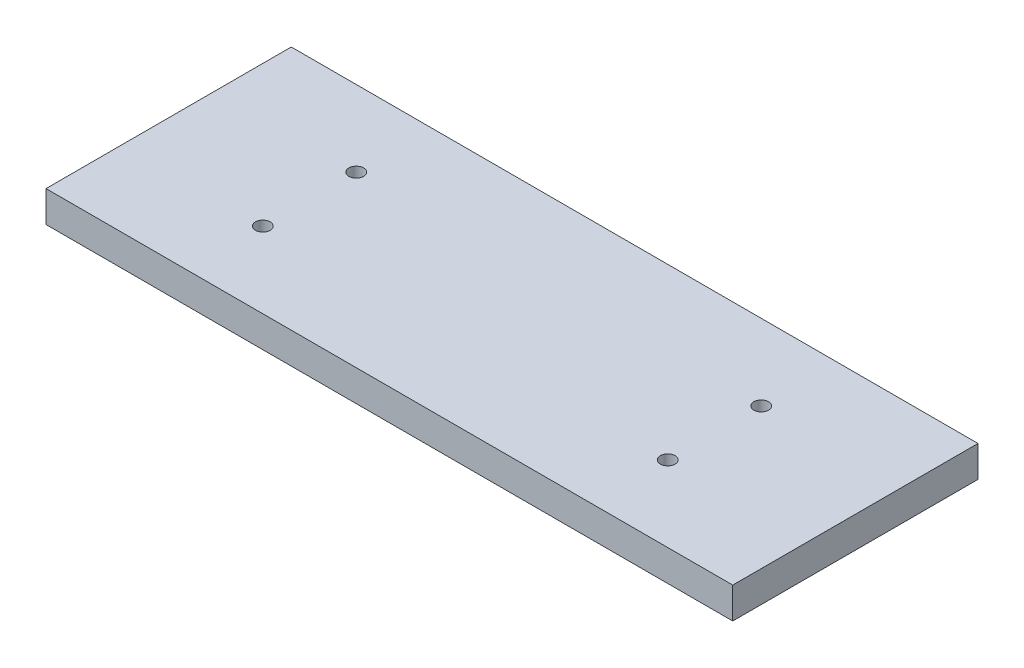
ISO-10303-21;
HEADER;
FILE_DESCRIPTION(('STEP AP214'),'2;1');
FILE_NAME('part.step','',(''),(''),'','','');
FILE_SCHEMA(('AUTOMOTIVE_DESIGN { 1 0 10303 214 1 1 1 1 }'));
ENDSEC;
DATA;
#1=APPLICATION_CONTEXT('core data for automotive mechanical design processes');
#2=APPLICATION_PROTOCOL_DEFINITION('international standard','automotive_design',2000,#1);
#3=PRODUCT_CONTEXT('',#1,'mechanical');
#4=PRODUCT('Part','Part','',(#3));
#5=PRODUCT_RELATED_PRODUCT_CATEGORY('part','',(#4));
#6=PRODUCT_DEFINITION_FORMATION('','',#4);
#7=PRODUCT_DEFINITION_CONTEXT('part definition',#1,'design');
#8=PRODUCT_DEFINITION('design','',#6,#7);
#9=PRODUCT_DEFINITION_SHAPE('','',#8);
#10=(LENGTH_UNIT() NAMED_UNIT(*) SI_UNIT(.MILLI.,.METRE.));
#11=(NAMED_UNIT(*) PLANE_ANGLE_UNIT() SI_UNIT($,.RADIAN.));
#12=(NAMED_UNIT(*) SI_UNIT($,.STERADIAN.) SOLID_ANGLE_UNIT());
#13=UNCERTAINTY_MEASURE_WITH_UNIT(LENGTH_MEASURE(1.E-05),#10,'distance_accuracy_value','');
#14=(GEOMETRIC_REPRESENTATION_CONTEXT(3) GLOBAL_UNCERTAINTY_ASSIGNED_CONTEXT((#13)) GLOBAL_UNIT_ASSIGNED_CONTEXT((#10,
#11,#12)) REPRESENTATION_CONTEXT('',''));
#15=CARTESIAN_POINT('',(0.,0.,0.));
#16=DIRECTION('',(0.,0.,1.));
#17=DIRECTION('',(1.,0.,0.));
#18=AXIS2_PLACEMENT_3D('',#15,#16,#17);
#19=CARTESIAN_POINT('',(-63.8053097345133,6.35,-18.1194690265487));
#20=DIRECTION('',(1.,0.,0.));
#21=DIRECTION('',(0.,0.,-1.));
#22=AXIS2_PLACEMENT_3D('',#19,#20,#21);
#23=PLANE('',#22);
#24=DIRECTION('',(0.,0.,1.));
#25=VECTOR('',#24,1.);
#26=CARTESIAN_POINT('',(-63.8053097345133,0.,-18.1194690265487));
#27=LINE('',#26,#25);
#28=CARTESIAN_POINT('',(-63.8053097345133,0.,-18.1194690265487));
#29=VERTEX_POINT('',#28);
#30=CARTESIAN_POINT('',(-63.8053097345133,0.,31.8805309734513));
#31=VERTEX_POINT('',#30);
#32=EDGE_CURVE('E96',#29,#31,#27,.T.);
#33=ORIENTED_EDGE('',*,*,#32,.T.);
#34=DIRECTION('',(0.,-1.,0.));
#35=VECTOR('',#34,1.);
#36=CARTESIAN_POINT('',(-63.8053097345133,6.35,31.8805309734513));
#37=LINE('',#36,#35);
#38=CARTESIAN_POINT('',(-63.8053097345133,6.35,31.8805309734513));
#39=VERTEX_POINT('',#38);
#40=EDGE_CURVE('E11',#39,#31,#37,.T.);
#41=ORIENTED_EDGE('',*,*,#40,.F.);
#42=DIRECTION('',(0.,0.,1.));
#43=VECTOR('',#42,1.);
#44=CARTESIAN_POINT('',(-63.8053097345133,6.35,-18.1194690265487));
#45=LINE('',#44,#43);
#46=CARTESIAN_POINT('',(-63.8053097345133,6.35,-18.1194690265487));
#47=VERTEX_POINT('',#46);
#48=EDGE_CURVE('E84',#47,#39,#45,.T.);
#49=ORIENTED_EDGE('',*,*,#48,.F.);
#50=DIRECTION('',(0.,-1.,0.));
#51=VECTOR('',#50,1.);
#52=CARTESIAN_POINT('',(-63.8053097345133,6.35,-18.1194690265487));
#53=LINE('',#52,#51);
#54=EDGE_CURVE('E92',#47,#29,#53,.T.);
#55=ORIENTED_EDGE('',*,*,#54,.T.);
#56=EDGE_LOOP('',(#33,#41,#49,#55));
#57=FACE_BOUND('',#56,.T.);
#58=ADVANCED_FACE('F33',(#57),#23,.F.);
#59=CARTESIAN_POINT('',(-63.8053097345133,6.35,31.8805309734513));
#60=DIRECTION('',(0.,0.,-1.));
#61=DIRECTION('',(-1.,0.,0.));
#62=AXIS2_PLACEMENT_3D('',#59,#60,#61);
#63=PLANE('',#62);
#64=DIRECTION('',(1.,0.,0.));
#65=VECTOR('',#64,1.);
#66=CARTESIAN_POINT('',(-63.8053097345133,0.,31.8805309734513));
#67=LINE('',#66,#65);
#68=CARTESIAN_POINT('',(76.1946902654867,0.,31.8805309734513));
#69=VERTEX_POINT('',#68);
#70=EDGE_CURVE('E88',#31,#69,#67,.T.);
#71=ORIENTED_EDGE('',*,*,#70,.T.);
#72=DIRECTION('',(0.,-1.,0.));
#73=VECTOR('',#72,1.);
#74=CARTESIAN_POINT('',(76.1946902654867,6.35,31.8805309734513));
#75=LINE('',#74,#73);
#76=CARTESIAN_POINT('',(76.1946902654867,6.35,31.8805309734513));
#77=VERTEX_POINT('',#76);
#78=EDGE_CURVE('E41',#77,#69,#75,.T.);
#79=ORIENTED_EDGE('',*,*,#78,.F.);
#80=DIRECTION('',(1.,0.,0.));
#81=VECTOR('',#80,1.);
#82=CARTESIAN_POINT('',(-63.8053097345133,6.35,31.8805309734513));
#83=LINE('',#82,#81);
#84=EDGE_CURVE('E79',#39,#77,#83,.T.);
#85=ORIENTED_EDGE('',*,*,#84,.F.);
#86=ORIENTED_EDGE('',*,*,#40,.T.);
#87=EDGE_LOOP('',(#71,#79,#85,#86));
#88=FACE_BOUND('',#87,.T.);
#89=ADVANCED_FACE('F87',(#88),#63,.F.);
#90=CARTESIAN_POINT('',(76.1946902654867,6.35,-18.1194690265487));
#91=DIRECTION('',(-1.,0.,0.));
#92=DIRECTION('',(0.,0.,1.));
#93=AXIS2_PLACEMENT_3D('',#90,#91,#92);
#94=PLANE('',#93);
#95=DIRECTION('',(0.,0.,-1.));
#96=VECTOR('',#95,1.);
#97=CARTESIAN_POINT('',(76.1946902654867,0.,-18.1194690265487));
#98=LINE('',#97,#96);
#99=CARTESIAN_POINT('',(76.1946902654867,0.,-18.1194690265487));
#100=VERTEX_POINT('',#99);
#101=EDGE_CURVE('E66',#69,#100,#98,.T.);
#102=ORIENTED_EDGE('',*,*,#101,.T.);
#103=DIRECTION('',(0.,-1.,0.));
#104=VECTOR('',#103,1.);
#105=CARTESIAN_POINT('',(76.1946902654867,6.35,-18.1194690265487));
#106=LINE('',#105,#104);
#107=CARTESIAN_POINT('',(76.1946902654867,6.35,-18.1194690265487));
#108=VERTEX_POINT('',#107);
#109=EDGE_CURVE('E89',#108,#100,#106,.T.);
#110=ORIENTED_EDGE('',*,*,#109,.F.);
#111=DIRECTION('',(0.,0.,-1.));
#112=VECTOR('',#111,1.);
#113=CARTESIAN_POINT('',(76.1946902654867,6.35,-18.1194690265487));
#114=LINE('',#113,#112);
#115=EDGE_CURVE('E82',#77,#108,#114,.T.);
#116=ORIENTED_EDGE('',*,*,#115,.F.);
#117=ORIENTED_EDGE('',*,*,#78,.T.);
#118=EDGE_LOOP('',(#102,#110,#116,#117));
#119=FACE_BOUND('',#118,.T.);
#120=ADVANCED_FACE('F90',(#119),#94,.F.);
#121=CARTESIAN_POINT('',(-63.8053097345133,6.35,-18.1194690265487));
#122=DIRECTION('',(0.,0.,1.));
#123=DIRECTION('',(1.,0.,0.));
#124=AXIS2_PLACEMENT_3D('',#121,#122,#123);
#125=PLANE('',#124);
#126=DIRECTION('',(-1.,0.,0.));
#127=VECTOR('',#126,1.);
#128=CARTESIAN_POINT('',(-63.8053097345133,0.,-18.1194690265487));
#129=LINE('',#128,#127);
#130=EDGE_CURVE('E72',#100,#29,#129,.T.);
#131=ORIENTED_EDGE('',*,*,#130,.T.);
#132=ORIENTED_EDGE('',*,*,#54,.F.);
#133=DIRECTION('',(-1.,0.,0.));
#134=VECTOR('',#133,1.);
#135=CARTESIAN_POINT('',(-63.8053097345133,6.35,-18.1194690265487));
#136=LINE('',#135,#134);
#137=EDGE_CURVE('E49',#108,#47,#136,.T.);
#138=ORIENTED_EDGE('',*,*,#137,.F.);
#139=ORIENTED_EDGE('',*,*,#109,.T.);
#140=EDGE_LOOP('',(#131,#132,#138,#139));
#141=FACE_BOUND('',#140,.T.);
#142=ADVANCED_FACE('F104',(#141),#125,.F.);
#143=CARTESIAN_POINT('',(0.,6.35,0.));
#144=DIRECTION('',(0.,1.,0.));
#145=DIRECTION('',(0.,0.,1.));
#146=AXIS2_PLACEMENT_3D('',#143,#144,#145);
#147=PLANE('',#146);
#148=CARTESIAN_POINT('',(-35.0803097345133,6.35,16.4055309734513));
#149=DIRECTION('',(0.,1.,0.));
#150=DIRECTION('',(0.,0.,1.));
#151=AXIS2_PLACEMENT_3D('',#148,#149,#150);
#152=CIRCLE('',#151,1.5);
#153=CARTESIAN_POINT('',(-35.0803097345133,6.35,17.9055309734513));
#154=VERTEX_POINT('',#153);
#155=EDGE_CURVE('E128',#154,#154,#152,.T.);
#156=ORIENTED_EDGE('',*,*,#155,.F.);
#157=EDGE_LOOP('',(#156));
#158=FACE_BOUND('',#157,.T.);
#159=CARTESIAN_POINT('',(47.4696902654867,6.35,16.4055309734513));
#160=DIRECTION('',(0.,1.,0.));
#161=DIRECTION('',(0.,0.,1.));
#162=AXIS2_PLACEMENT_3D('',#159,#160,#161);
#163=CIRCLE('',#162,1.5);
#164=CARTESIAN_POINT('',(47.4696902654867,6.35,17.9055309734513));
#165=VERTEX_POINT('',#164);
#166=EDGE_CURVE('E122',#165,#165,#163,.T.);
#167=ORIENTED_EDGE('',*,*,#166,.F.);
#168=EDGE_LOOP('',(#167));
#169=FACE_BOUND('',#168,.T.);
#170=CARTESIAN_POINT('',(47.4696902654867,6.35,-2.64446902654868));
#171=DIRECTION('',(0.,1.,0.));
#172=DIRECTION('',(0.,0.,1.));
#173=AXIS2_PLACEMENT_3D('',#170,#171,#172);
#174=CIRCLE('',#173,1.5);
#175=CARTESIAN_POINT('',(47.4696902654867,6.35,-1.14446902654868));
#176=VERTEX_POINT('',#175);
#177=EDGE_CURVE('E116',#176,#176,#174,.T.);
#178=ORIENTED_EDGE('',*,*,#177,.F.);
#179=EDGE_LOOP('',(#178));
#180=FACE_BOUND('',#179,.T.);
#181=CARTESIAN_POINT('',(-35.0803097345133,6.35,-2.64446902654868));
#182=DIRECTION('',(0.,1.,0.));
#183=DIRECTION('',(0.,0.,1.));
#184=AXIS2_PLACEMENT_3D('',#181,#182,#183);
#185=CIRCLE('',#184,1.5);
#186=CARTESIAN_POINT('',(-35.0803097345133,6.35,-1.14446902654868));
#187=VERTEX_POINT('',#186);
#188=EDGE_CURVE('E110',#187,#187,#185,.T.);
#189=ORIENTED_EDGE('',*,*,#188,.F.);
#190=EDGE_LOOP('',(#189));
#191=FACE_BOUND('',#190,.T.);
#192=ORIENTED_EDGE('',*,*,#48,.T.);
#193=ORIENTED_EDGE('',*,*,#84,.T.);
#194=ORIENTED_EDGE('',*,*,#115,.T.);
#195=ORIENTED_EDGE('',*,*,#137,.T.);
#196=EDGE_LOOP('',(#192,#193,#194,#195));
#197=FACE_BOUND('',#196,.T.);
#198=ADVANCED_FACE('F80',(#158,#169,#180,#191,#197),#147,.T.);
#199=CARTESIAN_POINT('',(0.,0.,0.));
#200=DIRECTION('',(0.,1.,0.));
#201=DIRECTION('',(0.,0.,1.));
#202=AXIS2_PLACEMENT_3D('',#199,#200,#201);
#203=PLANE('',#202);
#204=CARTESIAN_POINT('',(-35.0803097345133,0.,16.4055309734513));
#205=DIRECTION('',(0.,1.,0.));
#206=DIRECTION('',(0.,0.,1.));
#207=AXIS2_PLACEMENT_3D('',#204,#205,#206);
#208=CIRCLE('',#207,1.5);
#209=CARTESIAN_POINT('',(-35.0803097345133,0.,17.9055309734513));
#210=VERTEX_POINT('',#209);
#211=EDGE_CURVE('E113',#210,#210,#208,.T.);
#212=ORIENTED_EDGE('',*,*,#211,.T.);
#213=EDGE_LOOP('',(#212));
#214=FACE_BOUND('',#213,.T.);
#215=CARTESIAN_POINT('',(47.4696902654867,0.,16.4055309734513));
#216=DIRECTION('',(0.,1.,0.));
#217=DIRECTION('',(0.,0.,1.));
#218=AXIS2_PLACEMENT_3D('',#215,#216,#217);
#219=CIRCLE('',#218,1.5);
#220=CARTESIAN_POINT('',(47.4696902654867,0.,17.9055309734513));
#221=VERTEX_POINT('',#220);
#222=EDGE_CURVE('E125',#221,#221,#219,.T.);
#223=ORIENTED_EDGE('',*,*,#222,.T.);
#224=EDGE_LOOP('',(#223));
#225=FACE_BOUND('',#224,.T.);
#226=CARTESIAN_POINT('',(47.4696902654867,0.,-2.64446902654868));
#227=DIRECTION('',(0.,1.,0.));
#228=DIRECTION('',(0.,0.,1.));
#229=AXIS2_PLACEMENT_3D('',#226,#227,#228);
#230=CIRCLE('',#229,1.5);
#231=CARTESIAN_POINT('',(47.4696902654867,0.,-1.14446902654868));
#232=VERTEX_POINT('',#231);
#233=EDGE_CURVE('E119',#232,#232,#230,.T.);
#234=ORIENTED_EDGE('',*,*,#233,.T.);
#235=EDGE_LOOP('',(#234));
#236=FACE_BOUND('',#235,.T.);
#237=CARTESIAN_POINT('',(-35.0803097345133,0.,-2.64446902654868));
#238=DIRECTION('',(0.,1.,0.));
#239=DIRECTION('',(0.,0.,1.));
#240=AXIS2_PLACEMENT_3D('',#237,#238,#239);
#241=CIRCLE('',#240,1.5);
#242=CARTESIAN_POINT('',(-35.0803097345133,0.,-1.14446902654868));
#243=VERTEX_POINT('',#242);
#244=EDGE_CURVE('E99',#243,#243,#241,.T.);
#245=ORIENTED_EDGE('',*,*,#244,.T.);
#246=EDGE_LOOP('',(#245));
#247=FACE_BOUND('',#246,.T.);
#248=ORIENTED_EDGE('',*,*,#32,.F.);
#249=ORIENTED_EDGE('',*,*,#130,.F.);
#250=ORIENTED_EDGE('',*,*,#101,.F.);
#251=ORIENTED_EDGE('',*,*,#70,.F.);
#252=EDGE_LOOP('',(#248,#249,#250,#251));
#253=FACE_BOUND('',#252,.T.);
#254=ADVANCED_FACE('F107',(#214,#225,#236,#247,#253),#203,.F.);
#255=CARTESIAN_POINT('',(-35.0803097345133,0.,-2.64446902654868));
#256=DIRECTION('',(0.,1.,0.));
#257=DIRECTION('',(0.,0.,1.));
#258=AXIS2_PLACEMENT_3D('',#255,#256,#257);
#259=CYLINDRICAL_SURFACE('',#258,1.5);
#260=ORIENTED_EDGE('',*,*,#244,.F.);
#261=EDGE_LOOP('',(#260));
#262=FACE_BOUND('',#261,.T.);
#263=ORIENTED_EDGE('',*,*,#188,.T.);
#264=EDGE_LOOP('',(#263));
#265=FACE_BOUND('',#264,.T.);
#266=ADVANCED_FACE('F152',(#262,#265),#259,.F.);
#267=CARTESIAN_POINT('',(47.4696902654867,0.,-2.64446902654868));
#268=DIRECTION('',(0.,1.,0.));
#269=DIRECTION('',(0.,0.,1.));
#270=AXIS2_PLACEMENT_3D('',#267,#268,#269);
#271=CYLINDRICAL_SURFACE('',#270,1.5);
#272=ORIENTED_EDGE('',*,*,#233,.F.);
#273=EDGE_LOOP('',(#272));
#274=FACE_BOUND('',#273,.T.);
#275=ORIENTED_EDGE('',*,*,#177,.T.);
#276=EDGE_LOOP('',(#275));
#277=FACE_BOUND('',#276,.T.);
#278=ADVANCED_FACE('F154',(#274,#277),#271,.F.);
#279=CARTESIAN_POINT('',(47.4696902654867,0.,16.4055309734513));
#280=DIRECTION('',(0.,1.,0.));
#281=DIRECTION('',(0.,0.,1.));
#282=AXIS2_PLACEMENT_3D('',#279,#280,#281);
#283=CYLINDRICAL_SURFACE('',#282,1.5);
#284=ORIENTED_EDGE('',*,*,#222,.F.);
#285=EDGE_LOOP('',(#284));
#286=FACE_BOUND('',#285,.T.);
#287=ORIENTED_EDGE('',*,*,#166,.T.);
#288=EDGE_LOOP('',(#287));
#289=FACE_BOUND('',#288,.T.);
#290=ADVANCED_FACE('F139',(#286,#289),#283,.F.);
#291=CARTESIAN_POINT('',(-35.0803097345133,0.,16.4055309734513));
#292=DIRECTION('',(0.,1.,0.));
#293=DIRECTION('',(0.,0.,1.));
#294=AXIS2_PLACEMENT_3D('',#291,#292,#293);
#295=CYLINDRICAL_SURFACE('',#294,1.5);
#296=ORIENTED_EDGE('',*,*,#211,.F.);
#297=EDGE_LOOP('',(#296));
#298=FACE_BOUND('',#297,.T.);
#299=ORIENTED_EDGE('',*,*,#155,.T.);
#300=EDGE_LOOP('',(#299));
#301=FACE_BOUND('',#300,.T.);
#302=ADVANCED_FACE('F136',(#298,#301),#295,.F.);
#303=CLOSED_SHELL('',(#58,#89,#120,#142,#198,#254,#266,#278,#290,#302));
#304=MANIFOLD_SOLID_BREP('B2',#303);
#305=ADVANCED_BREP_SHAPE_REPRESENTATION('',(#18,#304),#14);
#306=SHAPE_DEFINITION_REPRESENTATION(#9,#305);
ENDSEC;
END-ISO-10303-21;
